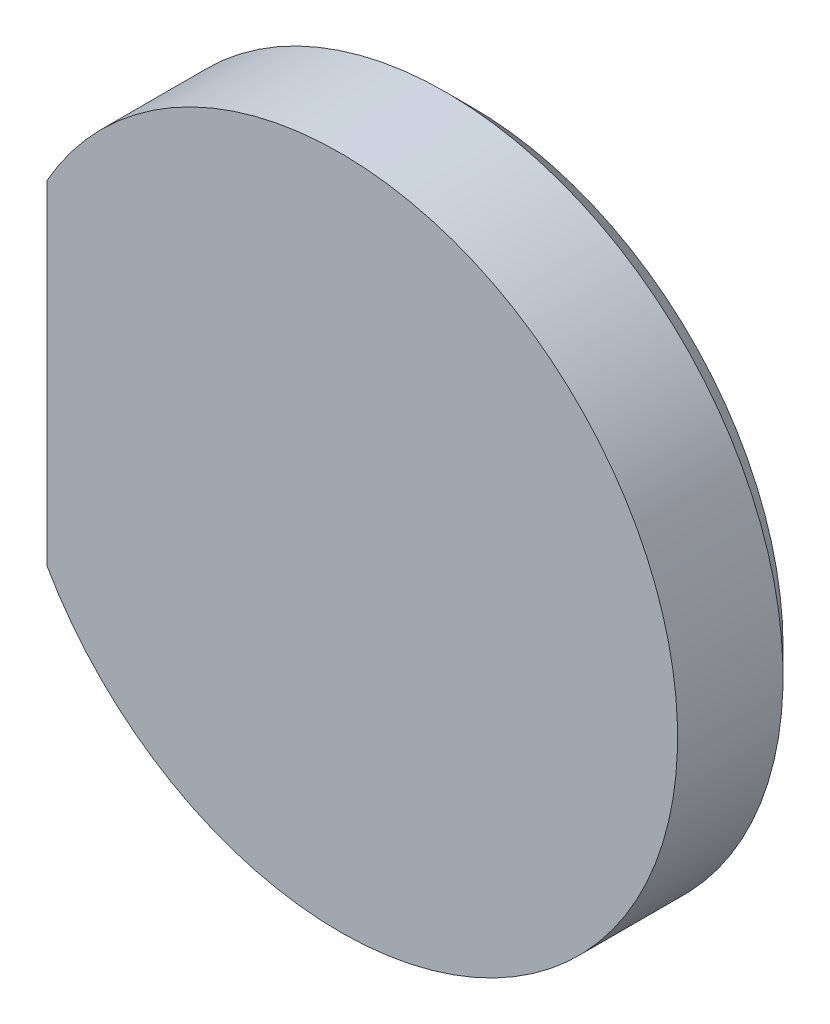
ISO-10303-21;
HEADER;
FILE_DESCRIPTION(('STEP AP214'),'2;1');
FILE_NAME('part.step','',(''),(''),'','','');
FILE_SCHEMA(('AUTOMOTIVE_DESIGN { 1 0 10303 214 1 1 1 1 }'));
ENDSEC;
DATA;
#1=APPLICATION_CONTEXT('core data for automotive mechanical design processes');
#2=APPLICATION_PROTOCOL_DEFINITION('international standard','automotive_design',2000,#1);
#3=PRODUCT_CONTEXT('',#1,'mechanical');
#4=PRODUCT('Part','Part','',(#3));
#5=PRODUCT_RELATED_PRODUCT_CATEGORY('part','',(#4));
#6=PRODUCT_DEFINITION_FORMATION('','',#4);
#7=PRODUCT_DEFINITION_CONTEXT('part definition',#1,'design');
#8=PRODUCT_DEFINITION('design','',#6,#7);
#9=PRODUCT_DEFINITION_SHAPE('','',#8);
#10=(LENGTH_UNIT() NAMED_UNIT(*) SI_UNIT(.MILLI.,.METRE.));
#11=(NAMED_UNIT(*) PLANE_ANGLE_UNIT() SI_UNIT($,.RADIAN.));
#12=(NAMED_UNIT(*) SI_UNIT($,.STERADIAN.) SOLID_ANGLE_UNIT());
#13=UNCERTAINTY_MEASURE_WITH_UNIT(LENGTH_MEASURE(1.E-05),#10,'distance_accuracy_value','');
#14=(GEOMETRIC_REPRESENTATION_CONTEXT(3) GLOBAL_UNCERTAINTY_ASSIGNED_CONTEXT((#13)) GLOBAL_UNIT_ASSIGNED_CONTEXT((#10,
#11,#12)) REPRESENTATION_CONTEXT('',''));
#15=CARTESIAN_POINT('',(0.,0.,0.));
#16=DIRECTION('',(0.,0.,1.));
#17=DIRECTION('',(1.,0.,0.));
#18=AXIS2_PLACEMENT_3D('',#15,#16,#17);
#19=CARTESIAN_POINT('',(0.,0.,10.));
#20=DIRECTION('',(0.,0.,-1.));
#21=DIRECTION('',(-1.,0.,0.));
#22=AXIS2_PLACEMENT_3D('',#19,#20,#21);
#23=CYLINDRICAL_SURFACE('',#22,25.6);
#24=CARTESIAN_POINT('',(0.,0.,2.00000000000002));
#25=DIRECTION('',(0.,0.,1.));
#26=DIRECTION('',(1.,0.,0.));
#27=AXIS2_PLACEMENT_3D('',#24,#25,#26);
#28=CIRCLE('',#27,25.6);
#29=CARTESIAN_POINT('',(-22.25,-12.6608648993661,2.00000000000002));
#30=VERTEX_POINT('',#29);
#31=CARTESIAN_POINT('',(-22.25,12.6608648993661,2.00000000000002));
#32=VERTEX_POINT('',#31);
#33=EDGE_CURVE('E139',#30,#32,#28,.T.);
#34=ORIENTED_EDGE('',*,*,#33,.T.);
#35=DIRECTION('',(0.,0.,-1.));
#36=VECTOR('',#35,1.);
#37=CARTESIAN_POINT('',(-22.25,12.6608648993661,10.));
#38=LINE('',#37,#36);
#39=CARTESIAN_POINT('',(-22.25,12.6608648993661,7.5));
#40=VERTEX_POINT('',#39);
#41=EDGE_CURVE('E188',#32,#40,#38,.F.);
#42=ORIENTED_EDGE('',*,*,#41,.T.);
#43=DIRECTION('',(0.,0.,1.));
#44=VECTOR('',#43,1.);
#45=CARTESIAN_POINT('',(-22.25,12.6608648993661,7.5));
#46=LINE('',#45,#44);
#47=CARTESIAN_POINT('',(-22.25,12.6608648993661,10.));
#48=VERTEX_POINT('',#47);
#49=EDGE_CURVE('E128',#40,#48,#46,.T.);
#50=ORIENTED_EDGE('',*,*,#49,.T.);
#51=CARTESIAN_POINT('',(0.,0.,10.));
#52=DIRECTION('',(0.,0.,1.));
#53=DIRECTION('',(1.,0.,0.));
#54=AXIS2_PLACEMENT_3D('',#51,#52,#53);
#55=CIRCLE('',#54,25.6);
#56=CARTESIAN_POINT('',(-22.25,-12.6608648993661,10.));
#57=VERTEX_POINT('',#56);
#58=EDGE_CURVE('E133',#57,#48,#55,.T.);
#59=ORIENTED_EDGE('',*,*,#58,.F.);
#60=DIRECTION('',(0.,0.,1.));
#61=VECTOR('',#60,1.);
#62=CARTESIAN_POINT('',(-22.25,-12.6608648993661,7.5));
#63=LINE('',#62,#61);
#64=CARTESIAN_POINT('',(-22.25,-12.6608648993661,7.5));
#65=VERTEX_POINT('',#64);
#66=EDGE_CURVE('E125',#65,#57,#63,.T.);
#67=ORIENTED_EDGE('',*,*,#66,.F.);
#68=DIRECTION('',(0.,0.,-1.));
#69=VECTOR('',#68,1.);
#70=CARTESIAN_POINT('',(-22.25,-12.6608648993661,10.));
#71=LINE('',#70,#69);
#72=EDGE_CURVE('E113',#65,#30,#71,.T.);
#73=ORIENTED_EDGE('',*,*,#72,.T.);
#74=EDGE_LOOP('',(#34,#42,#50,#59,#67,#73));
#75=FACE_BOUND('',#74,.T.);
#76=ADVANCED_FACE('F39',(#75),#23,.T.);
#77=CARTESIAN_POINT('',(0.,0.,10.));
#78=DIRECTION('',(0.,0.,1.));
#79=DIRECTION('',(1.,0.,0.));
#80=AXIS2_PLACEMENT_3D('',#77,#78,#79);
#81=PLANE('',#80);
#82=DIRECTION('',(0.,1.,0.));
#83=VECTOR('',#82,1.);
#84=CARTESIAN_POINT('',(-22.25,-12.6608648993661,10.));
#85=LINE('',#84,#83);
#86=EDGE_CURVE('E129',#57,#48,#85,.T.);
#87=ORIENTED_EDGE('',*,*,#86,.F.);
#88=ORIENTED_EDGE('',*,*,#58,.T.);
#89=EDGE_LOOP('',(#87,#88));
#90=FACE_BOUND('',#89,.T.);
#91=ADVANCED_FACE('F203',(#90),#81,.T.);
#92=CARTESIAN_POINT('',(0.,0.,0.));
#93=DIRECTION('',(0.,0.,1.));
#94=DIRECTION('',(1.,0.,0.));
#95=AXIS2_PLACEMENT_3D('',#92,#93,#94);
#96=PLANE('',#95);
#97=CARTESIAN_POINT('',(0.,0.,0.));
#98=DIRECTION('',(0.,0.,-1.));
#99=DIRECTION('',(-1.,0.,0.));
#100=AXIS2_PLACEMENT_3D('',#97,#98,#99);
#101=CIRCLE('',#100,23.2);
#102=CARTESIAN_POINT('',(-18.3383459937473,14.2107377082828,0.));
#103=VERTEX_POINT('',#102);
#104=CARTESIAN_POINT('',(-18.3383459937473,-14.2107377082828,0.));
#105=VERTEX_POINT('',#104);
#106=EDGE_CURVE('E288',#103,#105,#101,.T.);
#107=ORIENTED_EDGE('',*,*,#106,.F.);
#108=CARTESIAN_POINT('',(-21.5001297857727,16.6608648993661,0.));
#109=DIRECTION('',(0.,0.,1.));
#110=DIRECTION('',(1.,0.,0.));
#111=AXIS2_PLACEMENT_3D('',#108,#109,#110);
#112=CIRCLE('',#111,4.);
#113=CARTESIAN_POINT('',(-19.6045660781875,13.1385306973793,0.));
#114=VERTEX_POINT('',#113);
#115=EDGE_CURVE('E152',#103,#114,#112,.F.);
#116=ORIENTED_EDGE('',*,*,#115,.T.);
#117=CARTESIAN_POINT('',(0.,0.,0.));
#118=DIRECTION('',(0.,0.,1.));
#119=DIRECTION('',(1.,0.,0.));
#120=AXIS2_PLACEMENT_3D('',#117,#118,#119);
#121=CIRCLE('',#120,23.6);
#122=CARTESIAN_POINT('',(-19.6045660781875,-13.1385306973793,0.));
#123=VERTEX_POINT('',#122);
#124=EDGE_CURVE('E141',#114,#123,#121,.F.);
#125=ORIENTED_EDGE('',*,*,#124,.T.);
#126=CARTESIAN_POINT('',(-21.5001297857727,-16.6608648993661,0.));
#127=DIRECTION('',(0.,0.,1.));
#128=DIRECTION('',(1.,0.,0.));
#129=AXIS2_PLACEMENT_3D('',#126,#127,#128);
#130=CIRCLE('',#129,4.);
#131=EDGE_CURVE('E150',#123,#105,#130,.F.);
#132=ORIENTED_EDGE('',*,*,#131,.T.);
#133=EDGE_LOOP('',(#107,#116,#125,#132));
#134=FACE_BOUND('',#133,.T.);
#135=ADVANCED_FACE('F169',(#134),#96,.F.);
#136=CARTESIAN_POINT('',(0.,0.,2.00000000000002));
#137=DIRECTION('',(0.,0.,1.));
#138=DIRECTION('',(1.,0.,0.));
#139=AXIS2_PLACEMENT_3D('',#136,#137,#138);
#140=CONICAL_SURFACE('',#139,25.6,0.785398163397451);
#141=ORIENTED_EDGE('',*,*,#124,.F.);
#142=CARTESIAN_POINT('',(-19.6045660781875,13.1385306973793,0.));
#143=CARTESIAN_POINT('',(-19.7111983474981,13.0811630520582,0.056649893209622));
#144=CARTESIAN_POINT('',(-19.8184115905578,13.0296896765841,0.11777643193506));
#145=CARTESIAN_POINT('',(-20.0328924680761,12.9378522573921,0.247333360235331));
#146=CARTESIAN_POINT('',(-20.1401595962638,12.897466919307,0.315749394526598));
#147=CARTESIAN_POINT('',(-20.3521627876251,12.827536277323,0.457200883248535));
#148=CARTESIAN_POINT('',(-20.4569099936604,12.7978113774607,0.530132855625713));
#149=CARTESIAN_POINT('',(-20.6653074961109,12.7474823519088,0.680597390757274));
#150=CARTESIAN_POINT('',(-20.7689574758929,12.7268807925381,0.758131241034896));
#151=CARTESIAN_POINT('',(-20.9778782578697,12.6936503994549,0.919283729299072));
#152=CARTESIAN_POINT('',(-21.0831022604671,12.6812835336465,1.00301577375014));
#153=CARTESIAN_POINT('',(-21.2926427723557,12.6648596516651,1.17441574176968));
#154=CARTESIAN_POINT('',(-21.3969413455902,12.660882160181,1.26211335221227));
#155=CARTESIAN_POINT('',(-21.5001297857664,12.6608648993661,1.35101362279295));
#156=B_SPLINE_CURVE_WITH_KNOTS('',3,(#142,#143,#144,#145,#146,#147,#148,#149,#150,#151,#152,
#153,#154,#155),.UNSPECIFIED.,.F.,.F.,(4,2,2,2,2,2,4),(0.,0.400595038157376,0.800415272330308,
1.19314255403062,1.58598023655185,1.99078393857333,2.39940792865749),.UNSPECIFIED.);
#157=CARTESIAN_POINT('',(-21.5001297857727,12.6608648993661,1.35101362279844));
#158=VERTEX_POINT('',#157);
#159=EDGE_CURVE('E160',#114,#158,#156,.T.);
#160=ORIENTED_EDGE('',*,*,#159,.T.);
#161=CARTESIAN_POINT('',(-33.5450796363998,12.6608648993661,12.2548444120513));
#162=CARTESIAN_POINT('',(-33.0681496117532,12.6608648993661,11.8086474316233));
#163=CARTESIAN_POINT('',(-32.5906362338201,12.6608648993661,11.3630730531243));
#164=CARTESIAN_POINT('',(-31.6342721074482,12.6608648993661,10.4733582816575));
#165=CARTESIAN_POINT('',(-31.1554213537786,12.6608648993661,10.0292178943129));
#166=CARTESIAN_POINT('',(-30.196277239315,12.6608648993661,9.14262041269006));
#167=CARTESIAN_POINT('',(-29.7159840720153,12.6608648993661,8.70016310922977));
#168=CARTESIAN_POINT('',(-28.7536833248291,12.6608648993661,7.81711873406071));
#169=CARTESIAN_POINT('',(-28.2716757459012,12.6608648993661,7.37653166130668));
#170=CARTESIAN_POINT('',(-26.8245027769415,12.6608648993661,6.05958116417405));
#171=CARTESIAN_POINT('',(-25.8564296305008,12.6608648993661,5.18640046158751));
#172=CARTESIAN_POINT('',(-24.3964947749329,12.6608648993661,3.88523480391182));
#173=CARTESIAN_POINT('',(-23.9085008355524,12.6608648993661,3.45290817059201));
#174=CARTESIAN_POINT('',(-22.9294908228125,12.6608648993661,2.59169214333629));
#175=CARTESIAN_POINT('',(-22.4384747656325,12.6608648993661,2.16280273102691));
#176=CARTESIAN_POINT('',(-21.4517100578476,12.6608648993661,1.30807967201165));
#177=CARTESIAN_POINT('',(-20.9559528429513,12.6608648993661,0.882255903741383));
#178=CARTESIAN_POINT('',(-19.9602333046163,12.6608648993661,0.0355608470320993));
#179=CARTESIAN_POINT('',(-19.4602710375575,12.6608648993661,-0.385310507626274));
#180=CARTESIAN_POINT('',(-18.455537284524,12.6608648993661,-1.22084647895496));
#181=CARTESIAN_POINT('',(-17.9507679240327,12.6608648993661,-1.63551364769924));
#182=CARTESIAN_POINT('',(-16.9351660277409,12.6608648993661,-2.45742906841258));
#183=CARTESIAN_POINT('',(-16.4243331661366,12.6608648993661,-2.86467691871959));
#184=CARTESIAN_POINT('',(-15.3942531778854,12.6608648993661,-3.67068935235314));
#185=CARTESIAN_POINT('',(-14.8749904883326,12.6608648993661,-4.06943408722395));
#186=CARTESIAN_POINT('',(-13.8275385363996,12.6608648993661,-4.85491866178087));
#187=CARTESIAN_POINT('',(-13.2993506803756,12.6608648993661,-5.2416603660613));
#188=CARTESIAN_POINT('',(-12.4983786077207,12.6608648993661,-5.81034809113479));
#189=CARTESIAN_POINT('',(-12.2297407403455,12.6608648993661,-5.99813910479184));
#190=CARTESIAN_POINT('',(-11.6893721963736,12.6608648993661,-6.36920432585129));
#191=CARTESIAN_POINT('',(-11.4176416316964,12.6608648993661,-6.55247869594839));
#192=CARTESIAN_POINT('',(-10.8705947461299,12.6608648993661,-6.91392557598366));
#193=CARTESIAN_POINT('',(-10.5952766253049,12.6608648993661,-7.09209536926353));
#194=CARTESIAN_POINT('',(-10.0407708447938,12.6608648993661,-7.44238067595657));
#195=CARTESIAN_POINT('',(-9.76158269971669,12.6608648993661,-7.61449542017065));
#196=CARTESIAN_POINT('',(-9.48028276429773,12.6608648993661,-7.78313364502807));
#197=B_SPLINE_CURVE_WITH_KNOTS('',3,(#161,#162,#163,#164,#165,#166,#167,#168,#169,#170,#171,
#172,#173,#174,#175,#176,#177,#178,#179,#180,#181,#182,#183,#184,#185,#186,#187,#188,#189,#190,
#191,#192,#193,#194,#195,#196),.UNSPECIFIED.,.F.,.F.,(4,2,2,2,2,2,2,2,2,2,2,2,2,2,2,2,2,4),(0.,
1.95933333410913,3.91867434235303,5.8777633097482,7.83685118207216,11.7478400708849,
13.7036907876014,15.6595310424486,17.6200936528658,19.5806300184939,21.540336430532,
23.5001486224454,25.4641220639299,27.427788871885,28.4110553487067,29.3942863552146,
30.3780312673414,31.3619007008725),.UNSPECIFIED.);
#198=EDGE_CURVE('E120',#32,#158,#197,.T.);
#199=ORIENTED_EDGE('',*,*,#198,.F.);
#200=ORIENTED_EDGE('',*,*,#33,.F.);
#201=CARTESIAN_POINT('',(-9.48028276429773,-12.6608648993661,-7.78313364502808));
#202=CARTESIAN_POINT('',(-9.76158269971669,-12.6608648993661,-7.61449542017065));
#203=CARTESIAN_POINT('',(-10.0407708447938,-12.6608648993661,-7.44238067595657));
#204=CARTESIAN_POINT('',(-10.5952766253049,-12.6608648993661,-7.09209536926353));
#205=CARTESIAN_POINT('',(-10.8705947461299,-12.6608648993661,-6.91392557598366));
#206=CARTESIAN_POINT('',(-11.4176416316964,-12.6608648993661,-6.55247869594839));
#207=CARTESIAN_POINT('',(-11.6893721963736,-12.6608648993661,-6.36920432585129));
#208=CARTESIAN_POINT('',(-12.2297407403455,-12.6608648993661,-5.99813910479184));
#209=CARTESIAN_POINT('',(-12.4983786077207,-12.6608648993661,-5.81034809113479));
#210=CARTESIAN_POINT('',(-13.2993506803756,-12.6608648993661,-5.2416603660613));
#211=CARTESIAN_POINT('',(-13.8275385363996,-12.6608648993661,-4.85491866178087));
#212=CARTESIAN_POINT('',(-14.8749904883326,-12.6608648993661,-4.06943408722395));
#213=CARTESIAN_POINT('',(-15.3942531778854,-12.6608648993661,-3.67068935235315));
#214=CARTESIAN_POINT('',(-16.4243331661366,-12.6608648993661,-2.8646769187196));
#215=CARTESIAN_POINT('',(-16.9351660277409,-12.6608648993661,-2.45742906841258));
#216=CARTESIAN_POINT('',(-17.9507679240327,-12.6608648993661,-1.63551364769924));
#217=CARTESIAN_POINT('',(-18.455537284524,-12.6608648993661,-1.22084647895497));
#218=CARTESIAN_POINT('',(-19.4602710375575,-12.6608648993661,-0.385310507626275));
#219=CARTESIAN_POINT('',(-19.9602333046163,-12.6608648993661,0.0355608470320972));
#220=CARTESIAN_POINT('',(-20.9559528429513,-12.6608648993661,0.882255903741381));
#221=CARTESIAN_POINT('',(-21.4517100578476,-12.6608648993661,1.30807967201165));
#222=CARTESIAN_POINT('',(-22.4384747656325,-12.6608648993661,2.1628027310269));
#223=CARTESIAN_POINT('',(-22.9294908228125,-12.6608648993661,2.59169214333629));
#224=CARTESIAN_POINT('',(-23.9085008355524,-12.6608648993661,3.45290817059201));
#225=CARTESIAN_POINT('',(-24.3964947749329,-12.6608648993661,3.88523480391182));
#226=CARTESIAN_POINT('',(-25.8564296305008,-12.6608648993661,5.18640046158751));
#227=CARTESIAN_POINT('',(-26.8245027769415,-12.6608648993661,6.05958116417406));
#228=CARTESIAN_POINT('',(-28.2716757459012,-12.6608648993661,7.37653166130668));
#229=CARTESIAN_POINT('',(-28.7536833248291,-12.6608648993661,7.81711873406071));
#230=CARTESIAN_POINT('',(-29.7159840720153,-12.6608648993661,8.70016310922976));
#231=CARTESIAN_POINT('',(-30.196277239315,-12.6608648993661,9.14262041269006));
#232=CARTESIAN_POINT('',(-31.1554213537786,-12.6608648993661,10.0292178943129));
#233=CARTESIAN_POINT('',(-31.6342721074482,-12.6608648993661,10.4733582816575));
#234=CARTESIAN_POINT('',(-32.5906362338201,-12.6608648993661,11.3630730531243));
#235=CARTESIAN_POINT('',(-33.0681496117532,-12.6608648993661,11.8086474316233));
#236=CARTESIAN_POINT('',(-33.5450796363998,-12.6608648993661,12.2548444120513));
#237=B_SPLINE_CURVE_WITH_KNOTS('',3,(#201,#202,#203,#204,#205,#206,#207,#208,#209,#210,#211,
#212,#213,#214,#215,#216,#217,#218,#219,#220,#221,#222,#223,#224,#225,#226,#227,#228,#229,#230,
#231,#232,#233,#234,#235,#236),.UNSPECIFIED.,.F.,.F.,(4,2,2,2,2,2,2,2,2,2,2,2,2,2,2,2,2,4),(0.,
0.983869433531025,1.96761434565786,2.95084535216577,3.93411182898743,5.89777863694254,
7.86175207842707,9.82156427034048,11.7812706823786,13.7418070480067,15.7023696584238,
17.6582099132711,19.6140606299876,23.5250495188003,25.4841373911242,27.4432263585194,
29.4025673667633,31.3619007008725),.UNSPECIFIED.);
#238=CARTESIAN_POINT('',(-21.5001297857728,-12.6608648993661,1.35101362279851));
#239=VERTEX_POINT('',#238);
#240=EDGE_CURVE('E109',#239,#30,#237,.T.);
#241=ORIENTED_EDGE('',*,*,#240,.F.);
#242=CARTESIAN_POINT('',(-21.5001297857727,-12.6608648993661,1.35101362278636));
#243=CARTESIAN_POINT('',(-21.3694279102216,-12.6609076844954,1.23843141174292));
#244=CARTESIAN_POINT('',(-21.2368985037487,-12.6672764987364,1.12770835123587));
#245=CARTESIAN_POINT('',(-20.9681799556349,-12.694070865661,0.911164349199904));
#246=CARTESIAN_POINT('',(-20.8319755081479,-12.7145684784633,0.80537151978192));
#247=CARTESIAN_POINT('',(-20.5612798241828,-12.7702259858508,0.60405476864014));
#248=CARTESIAN_POINT('',(-20.4268551299165,-12.8049391619013,0.50832091409542));
#249=CARTESIAN_POINT('',(-20.1571419427782,-12.8904103833586,0.326164683019243));
#250=CARTESIAN_POINT('',(-20.0218565884092,-12.9411266445795,0.239718834606359));
#251=CARTESIAN_POINT('',(-19.8398401217017,-13.0213477014141,0.131264207261869));
#252=CARTESIAN_POINT('',(-19.7928029605152,-13.0431631099855,0.103947509340468));
#253=CARTESIAN_POINT('',(-19.6986570369908,-13.0891073484886,0.0507879664631349));
#254=CARTESIAN_POINT('',(-19.6515491154515,-13.1132473194629,0.0249532733262971));
#255=CARTESIAN_POINT('',(-19.6045660781875,-13.1385306973793,0.));
#256=B_SPLINE_CURVE_WITH_KNOTS('',3,(#242,#243,#244,#245,#246,#247,#248,#249,#250,#251,#252,
#253,#254,#255),.UNSPECIFIED.,.F.,.F.,(4,2,2,2,2,2,4),(0.,0.517643873307395,1.03794757572844,
1.54302223256819,2.04678889812359,2.22255346627464,2.39920687262602),.UNSPECIFIED.);
#257=EDGE_CURVE('E154',#239,#123,#256,.T.);
#258=ORIENTED_EDGE('',*,*,#257,.T.);
#259=EDGE_LOOP('',(#141,#160,#199,#200,#241,#258));
#260=FACE_BOUND('',#259,.T.);
#261=ADVANCED_FACE('F165',(#260),#140,.T.);
#262=CARTESIAN_POINT('',(-22.25,-12.6608648993661,7.5));
#263=DIRECTION('',(1.,0.,0.));
#264=DIRECTION('',(0.,0.,-1.));
#265=AXIS2_PLACEMENT_3D('',#262,#263,#264);
#266=PLANE('',#265);
#267=ORIENTED_EDGE('',*,*,#86,.T.);
#268=ORIENTED_EDGE('',*,*,#49,.F.);
#269=DIRECTION('',(0.,1.,0.));
#270=VECTOR('',#269,1.);
#271=CARTESIAN_POINT('',(-22.25,-12.6608648993661,7.5));
#272=LINE('',#271,#270);
#273=EDGE_CURVE('E106',#65,#40,#272,.T.);
#274=ORIENTED_EDGE('',*,*,#273,.F.);
#275=ORIENTED_EDGE('',*,*,#66,.T.);
#276=EDGE_LOOP('',(#267,#268,#274,#275));
#277=FACE_BOUND('',#276,.T.);
#278=ADVANCED_FACE('F124',(#277),#266,.F.);
#279=CARTESIAN_POINT('',(0.,0.,7.5));
#280=DIRECTION('',(0.,0.,1.));
#281=DIRECTION('',(1.,0.,0.));
#282=AXIS2_PLACEMENT_3D('',#279,#280,#281);
#283=PLANE('',#282);
#284=DIRECTION('',(1.,0.,0.));
#285=VECTOR('',#284,1.);
#286=CARTESIAN_POINT('',(-17.5671731433861,12.6608648993661,7.5));
#287=LINE('',#286,#285);
#288=CARTESIAN_POINT('',(-21.5001297857727,12.6608648993661,7.5));
#289=VERTEX_POINT('',#288);
#290=EDGE_CURVE('E110',#40,#289,#287,.T.);
#291=ORIENTED_EDGE('',*,*,#290,.T.);
#292=CARTESIAN_POINT('',(-21.5001297857727,16.6608648993661,7.50000000000001));
#293=DIRECTION('',(0.,0.,1.));
#294=DIRECTION('',(1.,0.,0.));
#295=AXIS2_PLACEMENT_3D('',#292,#293,#294);
#296=CIRCLE('',#295,4.);
#297=CARTESIAN_POINT('',(-18.3383459937473,14.2107377082828,7.50000000000001));
#298=VERTEX_POINT('',#297);
#299=EDGE_CURVE('E48',#289,#298,#296,.T.);
#300=ORIENTED_EDGE('',*,*,#299,.T.);
#301=CARTESIAN_POINT('',(0.,0.,7.50000000000001));
#302=DIRECTION('',(0.,0.,1.));
#303=DIRECTION('',(1.,0.,0.));
#304=AXIS2_PLACEMENT_3D('',#301,#302,#303);
#305=CIRCLE('',#304,23.2);
#306=CARTESIAN_POINT('',(-18.3383459937473,-14.2107377082828,7.50000000000001));
#307=VERTEX_POINT('',#306);
#308=EDGE_CURVE('E292',#298,#307,#305,.F.);
#309=ORIENTED_EDGE('',*,*,#308,.T.);
#310=CARTESIAN_POINT('',(-21.5001297857727,-16.6608648993661,7.50000000000001));
#311=DIRECTION('',(0.,0.,1.));
#312=DIRECTION('',(1.,0.,0.));
#313=AXIS2_PLACEMENT_3D('',#310,#311,#312);
#314=CIRCLE('',#313,4.);
#315=CARTESIAN_POINT('',(-21.5001297857727,-12.6608648993661,7.5));
#316=VERTEX_POINT('',#315);
#317=EDGE_CURVE('E13',#307,#316,#314,.T.);
#318=ORIENTED_EDGE('',*,*,#317,.T.);
#319=DIRECTION('',(-1.,0.,0.));
#320=VECTOR('',#319,1.);
#321=CARTESIAN_POINT('',(-17.5671731433861,-12.6608648993661,7.5));
#322=LINE('',#321,#320);
#323=EDGE_CURVE('E102',#316,#65,#322,.T.);
#324=ORIENTED_EDGE('',*,*,#323,.T.);
#325=ORIENTED_EDGE('',*,*,#273,.T.);
#326=EDGE_LOOP('',(#291,#300,#309,#318,#324,#325));
#327=FACE_BOUND('',#326,.T.);
#328=ADVANCED_FACE('F104',(#327),#283,.F.);
#329=CARTESIAN_POINT('',(0.,0.,75.6195092941116));
#330=DIRECTION('',(0.,0.,-1.));
#331=DIRECTION('',(-1.,0.,0.));
#332=AXIS2_PLACEMENT_3D('',#329,#330,#331);
#333=CYLINDRICAL_SURFACE('',#332,23.2);
#334=ORIENTED_EDGE('',*,*,#308,.F.);
#335=DIRECTION('',(0.,0.,-1.));
#336=VECTOR('',#335,1.);
#337=CARTESIAN_POINT('',(-18.3383459937473,14.2107377082828,75.6195092941116));
#338=LINE('',#337,#336);
#339=EDGE_CURVE('E147',#298,#103,#338,.T.);
#340=ORIENTED_EDGE('',*,*,#339,.T.);
#341=ORIENTED_EDGE('',*,*,#106,.T.);
#342=DIRECTION('',(0.,0.,-1.));
#343=VECTOR('',#342,1.);
#344=CARTESIAN_POINT('',(-18.3383459937473,-14.2107377082828,75.6195092941116));
#345=LINE('',#344,#343);
#346=EDGE_CURVE('E144',#105,#307,#345,.F.);
#347=ORIENTED_EDGE('',*,*,#346,.T.);
#348=EDGE_LOOP('',(#334,#340,#341,#347));
#349=FACE_BOUND('',#348,.T.);
#350=ADVANCED_FACE('F195',(#349),#333,.F.);
#351=CARTESIAN_POINT('',(-17.5671731433861,-12.6608648993661,34.4982493779893));
#352=DIRECTION('',(0.,-1.,0.));
#353=DIRECTION('',(0.,0.,-1.));
#354=AXIS2_PLACEMENT_3D('',#351,#352,#353);
#355=PLANE('',#354);
#356=ORIENTED_EDGE('',*,*,#323,.F.);
#357=DIRECTION('',(0.,0.,-1.));
#358=VECTOR('',#357,1.);
#359=CARTESIAN_POINT('',(-21.5001297857727,-12.6608648993661,34.4982493779893));
#360=LINE('',#359,#358);
#361=EDGE_CURVE('E283',#316,#239,#360,.T.);
#362=ORIENTED_EDGE('',*,*,#361,.T.);
#363=ORIENTED_EDGE('',*,*,#240,.T.);
#364=ORIENTED_EDGE('',*,*,#72,.F.);
#365=EDGE_LOOP('',(#356,#362,#363,#364));
#366=FACE_BOUND('',#365,.T.);
#367=ADVANCED_FACE('F114',(#366),#355,.F.);
#368=CARTESIAN_POINT('',(-17.5671731433861,12.6608648993661,34.4982493779893));
#369=DIRECTION('',(0.,1.,0.));
#370=DIRECTION('',(0.,0.,1.));
#371=AXIS2_PLACEMENT_3D('',#368,#369,#370);
#372=PLANE('',#371);
#373=ORIENTED_EDGE('',*,*,#198,.T.);
#374=DIRECTION('',(0.,0.,-1.));
#375=VECTOR('',#374,1.);
#376=CARTESIAN_POINT('',(-21.5001297857727,12.6608648993661,34.4982493779893));
#377=LINE('',#376,#375);
#378=EDGE_CURVE('E61',#158,#289,#377,.F.);
#379=ORIENTED_EDGE('',*,*,#378,.T.);
#380=ORIENTED_EDGE('',*,*,#290,.F.);
#381=ORIENTED_EDGE('',*,*,#41,.F.);
#382=EDGE_LOOP('',(#373,#379,#380,#381));
#383=FACE_BOUND('',#382,.T.);
#384=ADVANCED_FACE('F190',(#383),#372,.F.);
#385=CARTESIAN_POINT('',(-21.5001297857727,16.6608648993661,75.6195092941116));
#386=DIRECTION('',(0.,0.,-1.));
#387=DIRECTION('',(-1.,0.,0.));
#388=AXIS2_PLACEMENT_3D('',#385,#386,#387);
#389=CYLINDRICAL_SURFACE('',#388,4.);
#390=ORIENTED_EDGE('',*,*,#299,.F.);
#391=ORIENTED_EDGE('',*,*,#378,.F.);
#392=ORIENTED_EDGE('',*,*,#159,.F.);
#393=ORIENTED_EDGE('',*,*,#115,.F.);
#394=ORIENTED_EDGE('',*,*,#339,.F.);
#395=EDGE_LOOP('',(#390,#391,#392,#393,#394));
#396=FACE_BOUND('',#395,.T.);
#397=ADVANCED_FACE('F172',(#396),#389,.T.);
#398=CARTESIAN_POINT('',(-21.5001297857727,-16.6608648993661,75.6195092941116));
#399=DIRECTION('',(0.,0.,-1.));
#400=DIRECTION('',(-1.,0.,0.));
#401=AXIS2_PLACEMENT_3D('',#398,#399,#400);
#402=CYLINDRICAL_SURFACE('',#401,4.);
#403=ORIENTED_EDGE('',*,*,#257,.F.);
#404=ORIENTED_EDGE('',*,*,#361,.F.);
#405=ORIENTED_EDGE('',*,*,#317,.F.);
#406=ORIENTED_EDGE('',*,*,#346,.F.);
#407=ORIENTED_EDGE('',*,*,#131,.F.);
#408=EDGE_LOOP('',(#403,#404,#405,#406,#407));
#409=FACE_BOUND('',#408,.T.);
#410=ADVANCED_FACE('F41',(#409),#402,.T.);
#411=CLOSED_SHELL('',(#76,#91,#135,#261,#278,#328,#350,#367,#384,#397,#410));
#412=MANIFOLD_SOLID_BREP('B2',#411);
#413=ADVANCED_BREP_SHAPE_REPRESENTATION('',(#18,#412),#14);
#414=SHAPE_DEFINITION_REPRESENTATION(#9,#413);
ENDSEC;
END-ISO-10303-21;
